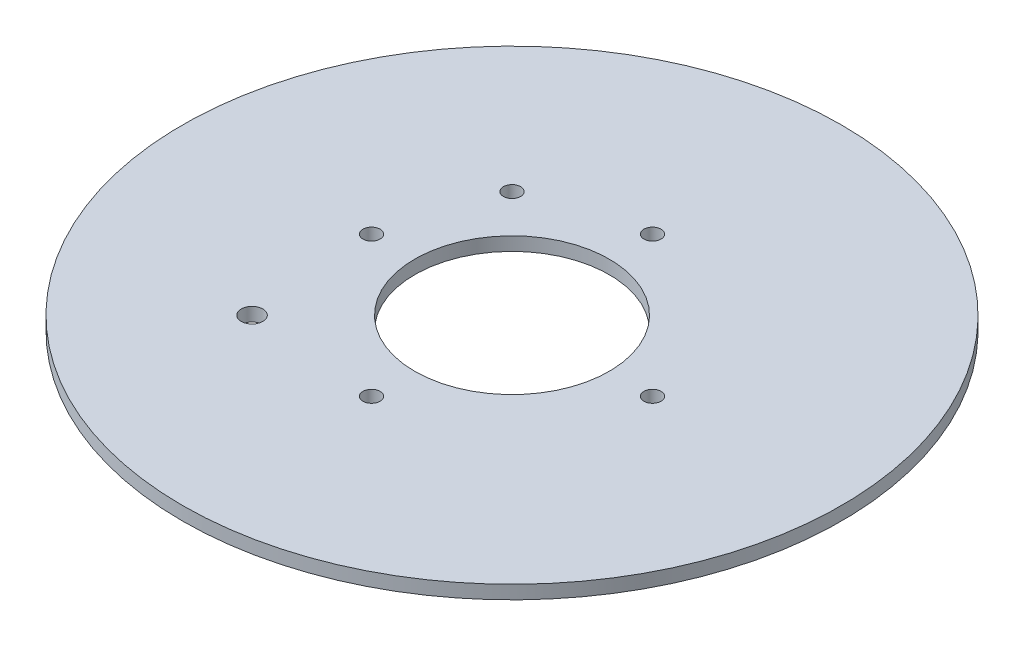
ISO-10303-21;
HEADER;
FILE_DESCRIPTION(('STEP AP214'),'2;1');
FILE_NAME('part.step','',(''),(''),'','','');
FILE_SCHEMA(('AUTOMOTIVE_DESIGN { 1 0 10303 214 1 1 1 1 }'));
ENDSEC;
DATA;
#1=APPLICATION_CONTEXT('core data for automotive mechanical design processes');
#2=APPLICATION_PROTOCOL_DEFINITION('international standard','automotive_design',2000,#1);
#3=PRODUCT_CONTEXT('',#1,'mechanical');
#4=PRODUCT('Part','Part','',(#3));
#5=PRODUCT_RELATED_PRODUCT_CATEGORY('part','',(#4));
#6=PRODUCT_DEFINITION_FORMATION('','',#4);
#7=PRODUCT_DEFINITION_CONTEXT('part definition',#1,'design');
#8=PRODUCT_DEFINITION('design','',#6,#7);
#9=PRODUCT_DEFINITION_SHAPE('','',#8);
#10=(LENGTH_UNIT() NAMED_UNIT(*) SI_UNIT(.MILLI.,.METRE.));
#11=(NAMED_UNIT(*) PLANE_ANGLE_UNIT() SI_UNIT($,.RADIAN.));
#12=(NAMED_UNIT(*) SI_UNIT($,.STERADIAN.) SOLID_ANGLE_UNIT());
#13=UNCERTAINTY_MEASURE_WITH_UNIT(LENGTH_MEASURE(1.E-05),#10,'distance_accuracy_value','');
#14=(GEOMETRIC_REPRESENTATION_CONTEXT(3) GLOBAL_UNCERTAINTY_ASSIGNED_CONTEXT((#13)) GLOBAL_UNIT_ASSIGNED_CONTEXT((#10,
#11,#12)) REPRESENTATION_CONTEXT('',''));
#15=CARTESIAN_POINT('',(0.,0.,0.));
#16=DIRECTION('',(0.,0.,1.));
#17=DIRECTION('',(1.,0.,0.));
#18=AXIS2_PLACEMENT_3D('',#15,#16,#17);
#19=CARTESIAN_POINT('',(0.,3.175,0.));
#20=DIRECTION('',(0.,-1.,0.));
#21=DIRECTION('',(0.,0.,-1.));
#22=AXIS2_PLACEMENT_3D('',#19,#20,#21);
#23=CYLINDRICAL_SURFACE('',#22,77.4600051);
#24=CARTESIAN_POINT('',(0.,3.175,0.));
#25=DIRECTION('',(0.,1.,0.));
#26=DIRECTION('',(0.,0.,1.));
#27=AXIS2_PLACEMENT_3D('',#24,#25,#26);
#28=CIRCLE('',#27,77.4600051);
#29=CARTESIAN_POINT('',(0.,3.175,77.4600051));
#30=VERTEX_POINT('',#29);
#31=EDGE_CURVE('E10',#30,#30,#28,.T.);
#32=ORIENTED_EDGE('',*,*,#31,.F.);
#33=EDGE_LOOP('',(#32));
#34=FACE_BOUND('',#33,.T.);
#35=CARTESIAN_POINT('',(0.,0.,0.));
#36=DIRECTION('',(0.,1.,0.));
#37=DIRECTION('',(0.,0.,1.));
#38=AXIS2_PLACEMENT_3D('',#35,#36,#37);
#39=CIRCLE('',#38,77.4600051);
#40=CARTESIAN_POINT('',(0.,0.,77.4600051));
#41=VERTEX_POINT('',#40);
#42=EDGE_CURVE('E33',#41,#41,#39,.T.);
#43=ORIENTED_EDGE('',*,*,#42,.T.);
#44=EDGE_LOOP('',(#43));
#45=FACE_BOUND('',#44,.T.);
#46=ADVANCED_FACE('F30',(#34,#45),#23,.T.);
#47=CARTESIAN_POINT('',(0.,3.175,0.));
#48=DIRECTION('',(0.,1.,0.));
#49=DIRECTION('',(0.,0.,1.));
#50=AXIS2_PLACEMENT_3D('',#47,#48,#49);
#51=PLANE('',#50);
#52=CARTESIAN_POINT('',(-30.5519464266559,3.175,30.5519464266555));
#53=DIRECTION('',(0.,-1.,0.));
#54=DIRECTION('',(0.,0.,-1.));
#55=AXIS2_PLACEMENT_3D('',#52,#53,#54);
#56=CIRCLE('',#55,2.53999999999999);
#57=CARTESIAN_POINT('',(-30.5519464266559,3.175,28.0119464266556));
#58=VERTEX_POINT('',#57);
#59=EDGE_CURVE('E77',#58,#58,#56,.T.);
#60=ORIENTED_EDGE('',*,*,#59,.T.);
#61=EDGE_LOOP('',(#60));
#62=FACE_BOUND('',#61,.T.);
#63=CARTESIAN_POINT('',(-25.1637927540144,3.175,-25.1637927540141));
#64=DIRECTION('',(0.,1.,0.));
#65=DIRECTION('',(0.,0.,1.));
#66=AXIS2_PLACEMENT_3D('',#63,#64,#65);
#67=CIRCLE('',#66,2.0193);
#68=CARTESIAN_POINT('',(-25.1637927540144,3.175,-23.1444927540141));
#69=VERTEX_POINT('',#68);
#70=EDGE_CURVE('E71',#69,#69,#67,.T.);
#71=ORIENTED_EDGE('',*,*,#70,.F.);
#72=EDGE_LOOP('',(#71));
#73=FACE_BOUND('',#72,.T.);
#74=CARTESIAN_POINT('',(-33.0199999999991,3.175,5.68989300120393E-13));
#75=DIRECTION('',(0.,1.,0.));
#76=DIRECTION('',(0.,0.,1.));
#77=AXIS2_PLACEMENT_3D('',#74,#75,#76);
#78=CIRCLE('',#77,2.0193);
#79=CARTESIAN_POINT('',(-33.0199999999991,3.175,2.01930000000057));
#80=VERTEX_POINT('',#79);
#81=EDGE_CURVE('E65',#80,#80,#78,.T.);
#82=ORIENTED_EDGE('',*,*,#81,.F.);
#83=EDGE_LOOP('',(#82));
#84=FACE_BOUND('',#83,.T.);
#85=CARTESIAN_POINT('',(1.63757896132211E-12,3.175,33.02));
#86=DIRECTION('',(0.,1.,0.));
#87=DIRECTION('',(0.,0.,1.));
#88=AXIS2_PLACEMENT_3D('',#85,#86,#87);
#89=CIRCLE('',#88,2.0193);
#90=CARTESIAN_POINT('',(1.63757896132211E-12,3.175,35.0393));
#91=VERTEX_POINT('',#90);
#92=EDGE_CURVE('E59',#91,#91,#89,.T.);
#93=ORIENTED_EDGE('',*,*,#92,.F.);
#94=EDGE_LOOP('',(#93));
#95=FACE_BOUND('',#94,.T.);
#96=CARTESIAN_POINT('',(33.0200000000009,3.175,-8.32667268468867E-13));
#97=DIRECTION('',(0.,1.,0.));
#98=DIRECTION('',(0.,0.,1.));
#99=AXIS2_PLACEMENT_3D('',#96,#97,#98);
#100=CIRCLE('',#99,2.01930000000001);
#101=CARTESIAN_POINT('',(33.0200000000009,3.175,2.01929999999917));
#102=VERTEX_POINT('',#101);
#103=EDGE_CURVE('E53',#102,#102,#100,.T.);
#104=ORIENTED_EDGE('',*,*,#103,.F.);
#105=EDGE_LOOP('',(#104));
#106=FACE_BOUND('',#105,.T.);
#107=CARTESIAN_POINT('',(0.,3.175,-33.02));
#108=DIRECTION('',(0.,1.,0.));
#109=DIRECTION('',(0.,0.,1.));
#110=AXIS2_PLACEMENT_3D('',#107,#108,#109);
#111=CIRCLE('',#110,2.01930000000001);
#112=CARTESIAN_POINT('',(0.,3.175,-31.0007));
#113=VERTEX_POINT('',#112);
#114=EDGE_CURVE('E47',#113,#113,#111,.T.);
#115=ORIENTED_EDGE('',*,*,#114,.F.);
#116=EDGE_LOOP('',(#115));
#117=FACE_BOUND('',#116,.T.);
#118=CARTESIAN_POINT('',(0.,3.175,0.));
#119=DIRECTION('',(0.,1.,0.));
#120=DIRECTION('',(0.,0.,1.));
#121=AXIS2_PLACEMENT_3D('',#118,#119,#120);
#122=CIRCLE('',#121,22.86);
#123=CARTESIAN_POINT('',(0.,3.175,22.86));
#124=VERTEX_POINT('',#123);
#125=EDGE_CURVE('E40',#124,#124,#122,.T.);
#126=ORIENTED_EDGE('',*,*,#125,.F.);
#127=EDGE_LOOP('',(#126));
#128=FACE_BOUND('',#127,.T.);
#129=ORIENTED_EDGE('',*,*,#31,.T.);
#130=EDGE_LOOP('',(#129));
#131=FACE_BOUND('',#130,.T.);
#132=ADVANCED_FACE('F84',(#62,#73,#84,#95,#106,#117,#128,#131),#51,.T.);
#133=CARTESIAN_POINT('',(0.,0.,0.));
#134=DIRECTION('',(0.,1.,0.));
#135=DIRECTION('',(0.,0.,1.));
#136=AXIS2_PLACEMENT_3D('',#133,#134,#135);
#137=PLANE('',#136);
#138=CARTESIAN_POINT('',(-30.5519464266559,0.,30.5519464266555));
#139=DIRECTION('',(0.,-1.,0.));
#140=DIRECTION('',(0.,0.,-1.));
#141=AXIS2_PLACEMENT_3D('',#138,#139,#140);
#142=CIRCLE('',#141,2.53999999999999);
#143=CARTESIAN_POINT('',(-30.5519464266559,0.,28.0119464266556));
#144=VERTEX_POINT('',#143);
#145=EDGE_CURVE('E78',#144,#144,#142,.T.);
#146=ORIENTED_EDGE('',*,*,#145,.F.);
#147=EDGE_LOOP('',(#146));
#148=FACE_BOUND('',#147,.T.);
#149=CARTESIAN_POINT('',(-25.1637927540144,0.,-25.1637927540141));
#150=DIRECTION('',(0.,1.,0.));
#151=DIRECTION('',(0.,0.,1.));
#152=AXIS2_PLACEMENT_3D('',#149,#150,#151);
#153=CIRCLE('',#152,2.0193);
#154=CARTESIAN_POINT('',(-25.1637927540144,0.,-23.1444927540141));
#155=VERTEX_POINT('',#154);
#156=EDGE_CURVE('E74',#155,#155,#153,.T.);
#157=ORIENTED_EDGE('',*,*,#156,.T.);
#158=EDGE_LOOP('',(#157));
#159=FACE_BOUND('',#158,.T.);
#160=CARTESIAN_POINT('',(-33.0199999999991,0.,5.68989300120393E-13));
#161=DIRECTION('',(0.,1.,0.));
#162=DIRECTION('',(0.,0.,1.));
#163=AXIS2_PLACEMENT_3D('',#160,#161,#162);
#164=CIRCLE('',#163,2.0193);
#165=CARTESIAN_POINT('',(-33.0199999999991,0.,2.01930000000057));
#166=VERTEX_POINT('',#165);
#167=EDGE_CURVE('E68',#166,#166,#164,.T.);
#168=ORIENTED_EDGE('',*,*,#167,.T.);
#169=EDGE_LOOP('',(#168));
#170=FACE_BOUND('',#169,.T.);
#171=CARTESIAN_POINT('',(1.63757896132211E-12,0.,33.02));
#172=DIRECTION('',(0.,1.,0.));
#173=DIRECTION('',(0.,0.,1.));
#174=AXIS2_PLACEMENT_3D('',#171,#172,#173);
#175=CIRCLE('',#174,2.0193);
#176=CARTESIAN_POINT('',(1.63757896132211E-12,0.,35.0393));
#177=VERTEX_POINT('',#176);
#178=EDGE_CURVE('E62',#177,#177,#175,.T.);
#179=ORIENTED_EDGE('',*,*,#178,.T.);
#180=EDGE_LOOP('',(#179));
#181=FACE_BOUND('',#180,.T.);
#182=CARTESIAN_POINT('',(33.0200000000009,0.,-8.32667268468867E-13));
#183=DIRECTION('',(0.,1.,0.));
#184=DIRECTION('',(0.,0.,1.));
#185=AXIS2_PLACEMENT_3D('',#182,#183,#184);
#186=CIRCLE('',#185,2.01930000000001);
#187=CARTESIAN_POINT('',(33.0200000000009,0.,2.01929999999917));
#188=VERTEX_POINT('',#187);
#189=EDGE_CURVE('E56',#188,#188,#186,.T.);
#190=ORIENTED_EDGE('',*,*,#189,.T.);
#191=EDGE_LOOP('',(#190));
#192=FACE_BOUND('',#191,.T.);
#193=CARTESIAN_POINT('',(0.,0.,-33.02));
#194=DIRECTION('',(0.,1.,0.));
#195=DIRECTION('',(0.,0.,1.));
#196=AXIS2_PLACEMENT_3D('',#193,#194,#195);
#197=CIRCLE('',#196,2.01930000000001);
#198=CARTESIAN_POINT('',(0.,0.,-31.0007));
#199=VERTEX_POINT('',#198);
#200=EDGE_CURVE('E50',#199,#199,#197,.T.);
#201=ORIENTED_EDGE('',*,*,#200,.T.);
#202=EDGE_LOOP('',(#201));
#203=FACE_BOUND('',#202,.T.);
#204=CARTESIAN_POINT('',(0.,0.,0.));
#205=DIRECTION('',(0.,1.,0.));
#206=DIRECTION('',(0.,0.,1.));
#207=AXIS2_PLACEMENT_3D('',#204,#205,#206);
#208=CIRCLE('',#207,22.86);
#209=CARTESIAN_POINT('',(0.,0.,22.86));
#210=VERTEX_POINT('',#209);
#211=EDGE_CURVE('E44',#210,#210,#208,.T.);
#212=ORIENTED_EDGE('',*,*,#211,.T.);
#213=EDGE_LOOP('',(#212));
#214=FACE_BOUND('',#213,.T.);
#215=ORIENTED_EDGE('',*,*,#42,.F.);
#216=EDGE_LOOP('',(#215));
#217=FACE_BOUND('',#216,.T.);
#218=ADVANCED_FACE('F94',(#148,#159,#170,#181,#192,#203,#214,#217),#137,.F.);
#219=CARTESIAN_POINT('',(0.,0.,0.));
#220=DIRECTION('',(0.,1.,0.));
#221=DIRECTION('',(0.,0.,1.));
#222=AXIS2_PLACEMENT_3D('',#219,#220,#221);
#223=CYLINDRICAL_SURFACE('',#222,22.86);
#224=ORIENTED_EDGE('',*,*,#125,.T.);
#225=EDGE_LOOP('',(#224));
#226=FACE_BOUND('',#225,.T.);
#227=ORIENTED_EDGE('',*,*,#211,.F.);
#228=EDGE_LOOP('',(#227));
#229=FACE_BOUND('',#228,.T.);
#230=ADVANCED_FACE('F97',(#226,#229),#223,.F.);
#231=CARTESIAN_POINT('',(0.,0.,-33.02));
#232=DIRECTION('',(0.,1.,0.));
#233=DIRECTION('',(0.,0.,1.));
#234=AXIS2_PLACEMENT_3D('',#231,#232,#233);
#235=CYLINDRICAL_SURFACE('',#234,2.01930000000001);
#236=ORIENTED_EDGE('',*,*,#114,.T.);
#237=EDGE_LOOP('',(#236));
#238=FACE_BOUND('',#237,.T.);
#239=ORIENTED_EDGE('',*,*,#200,.F.);
#240=EDGE_LOOP('',(#239));
#241=FACE_BOUND('',#240,.T.);
#242=ADVANCED_FACE('F123',(#238,#241),#235,.F.);
#243=CARTESIAN_POINT('',(33.0200000000009,0.,-8.32667268468867E-13));
#244=DIRECTION('',(0.,1.,0.));
#245=DIRECTION('',(0.,0.,1.));
#246=AXIS2_PLACEMENT_3D('',#243,#244,#245);
#247=CYLINDRICAL_SURFACE('',#246,2.01930000000001);
#248=ORIENTED_EDGE('',*,*,#103,.T.);
#249=EDGE_LOOP('',(#248));
#250=FACE_BOUND('',#249,.T.);
#251=ORIENTED_EDGE('',*,*,#189,.F.);
#252=EDGE_LOOP('',(#251));
#253=FACE_BOUND('',#252,.T.);
#254=ADVANCED_FACE('F127',(#250,#253),#247,.F.);
#255=CARTESIAN_POINT('',(1.63757896132211E-12,0.,33.02));
#256=DIRECTION('',(0.,1.,0.));
#257=DIRECTION('',(0.,0.,1.));
#258=AXIS2_PLACEMENT_3D('',#255,#256,#257);
#259=CYLINDRICAL_SURFACE('',#258,2.0193);
#260=ORIENTED_EDGE('',*,*,#92,.T.);
#261=EDGE_LOOP('',(#260));
#262=FACE_BOUND('',#261,.T.);
#263=ORIENTED_EDGE('',*,*,#178,.F.);
#264=EDGE_LOOP('',(#263));
#265=FACE_BOUND('',#264,.T.);
#266=ADVANCED_FACE('F131',(#262,#265),#259,.F.);
#267=CARTESIAN_POINT('',(-33.0199999999991,0.,5.68989300120393E-13));
#268=DIRECTION('',(0.,1.,0.));
#269=DIRECTION('',(0.,0.,1.));
#270=AXIS2_PLACEMENT_3D('',#267,#268,#269);
#271=CYLINDRICAL_SURFACE('',#270,2.0193);
#272=ORIENTED_EDGE('',*,*,#81,.T.);
#273=EDGE_LOOP('',(#272));
#274=FACE_BOUND('',#273,.T.);
#275=ORIENTED_EDGE('',*,*,#167,.F.);
#276=EDGE_LOOP('',(#275));
#277=FACE_BOUND('',#276,.T.);
#278=ADVANCED_FACE('F135',(#274,#277),#271,.F.);
#279=CARTESIAN_POINT('',(-25.1637927540144,0.,-25.1637927540141));
#280=DIRECTION('',(0.,1.,0.));
#281=DIRECTION('',(0.,0.,1.));
#282=AXIS2_PLACEMENT_3D('',#279,#280,#281);
#283=CYLINDRICAL_SURFACE('',#282,2.0193);
#284=ORIENTED_EDGE('',*,*,#70,.T.);
#285=EDGE_LOOP('',(#284));
#286=FACE_BOUND('',#285,.T.);
#287=ORIENTED_EDGE('',*,*,#156,.F.);
#288=EDGE_LOOP('',(#287));
#289=FACE_BOUND('',#288,.T.);
#290=ADVANCED_FACE('F90',(#286,#289),#283,.F.);
#291=CARTESIAN_POINT('',(-30.5519464266559,3.175,30.5519464266555));
#292=DIRECTION('',(0.,-1.,0.));
#293=DIRECTION('',(0.,0.,-1.));
#294=AXIS2_PLACEMENT_3D('',#291,#292,#293);
#295=CYLINDRICAL_SURFACE('',#294,2.53999999999999);
#296=ORIENTED_EDGE('',*,*,#59,.F.);
#297=EDGE_LOOP('',(#296));
#298=FACE_BOUND('',#297,.T.);
#299=ORIENTED_EDGE('',*,*,#145,.T.);
#300=EDGE_LOOP('',(#299));
#301=FACE_BOUND('',#300,.T.);
#302=ADVANCED_FACE('F87',(#298,#301),#295,.F.);
#303=CLOSED_SHELL('',(#46,#132,#218,#230,#242,#254,#266,#278,#290,#302));
#304=MANIFOLD_SOLID_BREP('B2',#303);
#305=ADVANCED_BREP_SHAPE_REPRESENTATION('',(#18,#304),#14);
#306=SHAPE_DEFINITION_REPRESENTATION(#9,#305);
ENDSEC;
END-ISO-10303-21;
